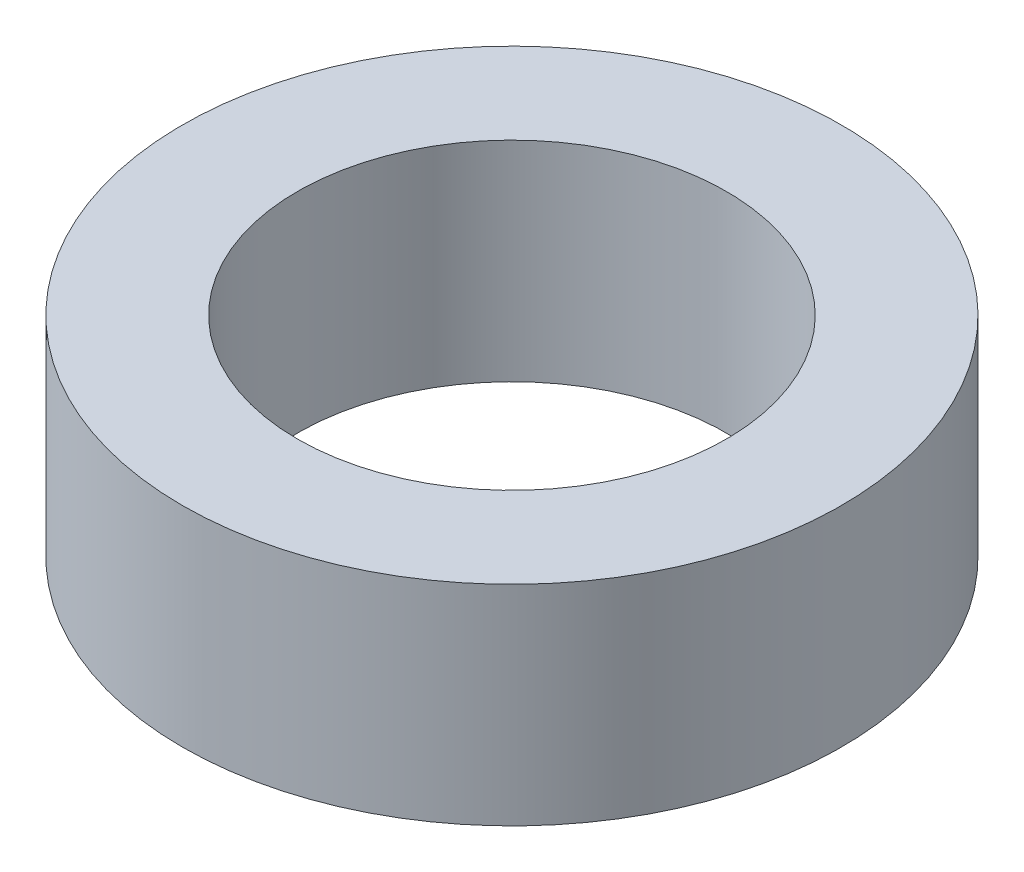
ISO-10303-21;
HEADER;
FILE_DESCRIPTION(('STEP AP214'),'2;1');
FILE_NAME('part.step','',(''),(''),'','','');
FILE_SCHEMA(('AUTOMOTIVE_DESIGN { 1 0 10303 214 1 1 1 1 }'));
ENDSEC;
DATA;
#1=APPLICATION_CONTEXT('core data for automotive mechanical design processes');
#2=APPLICATION_PROTOCOL_DEFINITION('international standard','automotive_design',2000,#1);
#3=PRODUCT_CONTEXT('',#1,'mechanical');
#4=PRODUCT('Part','Part','',(#3));
#5=PRODUCT_RELATED_PRODUCT_CATEGORY('part','',(#4));
#6=PRODUCT_DEFINITION_FORMATION('','',#4);
#7=PRODUCT_DEFINITION_CONTEXT('part definition',#1,'design');
#8=PRODUCT_DEFINITION('design','',#6,#7);
#9=PRODUCT_DEFINITION_SHAPE('','',#8);
#10=(LENGTH_UNIT() NAMED_UNIT(*) SI_UNIT(.MILLI.,.METRE.));
#11=(NAMED_UNIT(*) PLANE_ANGLE_UNIT() SI_UNIT($,.RADIAN.));
#12=(NAMED_UNIT(*) SI_UNIT($,.STERADIAN.) SOLID_ANGLE_UNIT());
#13=UNCERTAINTY_MEASURE_WITH_UNIT(LENGTH_MEASURE(1.E-05),#10,'distance_accuracy_value','');
#14=(GEOMETRIC_REPRESENTATION_CONTEXT(3) GLOBAL_UNCERTAINTY_ASSIGNED_CONTEXT((#13)) GLOBAL_UNIT_ASSIGNED_CONTEXT((#10,
#11,#12)) REPRESENTATION_CONTEXT('',''));
#15=CARTESIAN_POINT('',(0.,0.,0.));
#16=DIRECTION('',(0.,0.,1.));
#17=DIRECTION('',(1.,0.,0.));
#18=AXIS2_PLACEMENT_3D('',#15,#16,#17);
#19=CARTESIAN_POINT('',(0.,2.,0.));
#20=DIRECTION('',(0.,-1.,0.));
#21=DIRECTION('',(0.,0.,-1.));
#22=AXIS2_PLACEMENT_3D('',#19,#20,#21);
#23=CYLINDRICAL_SURFACE('',#22,2.05);
#24=CARTESIAN_POINT('',(0.,2.,0.));
#25=DIRECTION('',(0.,1.,0.));
#26=DIRECTION('',(0.,0.,1.));
#27=AXIS2_PLACEMENT_3D('',#24,#25,#26);
#28=CIRCLE('',#27,2.05);
#29=CARTESIAN_POINT('',(0.,2.,2.05));
#30=VERTEX_POINT('',#29);
#31=EDGE_CURVE('E40',#30,#30,#28,.T.);
#32=ORIENTED_EDGE('',*,*,#31,.T.);
#33=EDGE_LOOP('',(#32));
#34=FACE_BOUND('',#33,.T.);
#35=CARTESIAN_POINT('',(0.,0.,0.));
#36=DIRECTION('',(0.,1.,0.));
#37=DIRECTION('',(0.,0.,1.));
#38=AXIS2_PLACEMENT_3D('',#35,#36,#37);
#39=CIRCLE('',#38,2.05);
#40=CARTESIAN_POINT('',(0.,0.,2.05));
#41=VERTEX_POINT('',#40);
#42=EDGE_CURVE('E46',#41,#41,#39,.T.);
#43=ORIENTED_EDGE('',*,*,#42,.F.);
#44=EDGE_LOOP('',(#43));
#45=FACE_BOUND('',#44,.T.);
#46=ADVANCED_FACE('F33',(#34,#45),#23,.F.);
#47=CARTESIAN_POINT('',(0.,2.,0.));
#48=DIRECTION('',(0.,-1.,0.));
#49=DIRECTION('',(0.,0.,-1.));
#50=AXIS2_PLACEMENT_3D('',#47,#48,#49);
#51=CYLINDRICAL_SURFACE('',#50,3.15);
#52=CARTESIAN_POINT('',(0.,2.,0.));
#53=DIRECTION('',(0.,1.,0.));
#54=DIRECTION('',(0.,0.,1.));
#55=AXIS2_PLACEMENT_3D('',#52,#53,#54);
#56=CIRCLE('',#55,3.15);
#57=CARTESIAN_POINT('',(0.,2.,3.15));
#58=VERTEX_POINT('',#57);
#59=EDGE_CURVE('E10',#58,#58,#56,.T.);
#60=ORIENTED_EDGE('',*,*,#59,.F.);
#61=EDGE_LOOP('',(#60));
#62=FACE_BOUND('',#61,.T.);
#63=CARTESIAN_POINT('',(0.,0.,0.));
#64=DIRECTION('',(0.,1.,0.));
#65=DIRECTION('',(0.,0.,1.));
#66=AXIS2_PLACEMENT_3D('',#63,#64,#65);
#67=CIRCLE('',#66,3.15);
#68=CARTESIAN_POINT('',(0.,0.,3.15));
#69=VERTEX_POINT('',#68);
#70=EDGE_CURVE('E36',#69,#69,#67,.T.);
#71=ORIENTED_EDGE('',*,*,#70,.T.);
#72=EDGE_LOOP('',(#71));
#73=FACE_BOUND('',#72,.T.);
#74=ADVANCED_FACE('F53',(#62,#73),#51,.T.);
#75=CARTESIAN_POINT('',(0.,2.,0.));
#76=DIRECTION('',(0.,1.,0.));
#77=DIRECTION('',(0.,0.,1.));
#78=AXIS2_PLACEMENT_3D('',#75,#76,#77);
#79=PLANE('',#78);
#80=ORIENTED_EDGE('',*,*,#31,.F.);
#81=EDGE_LOOP('',(#80));
#82=FACE_BOUND('',#81,.T.);
#83=ORIENTED_EDGE('',*,*,#59,.T.);
#84=EDGE_LOOP('',(#83));
#85=FACE_BOUND('',#84,.T.);
#86=ADVANCED_FACE('F57',(#82,#85),#79,.T.);
#87=CARTESIAN_POINT('',(0.,0.,0.));
#88=DIRECTION('',(0.,1.,0.));
#89=DIRECTION('',(0.,0.,1.));
#90=AXIS2_PLACEMENT_3D('',#87,#88,#89);
#91=PLANE('',#90);
#92=ORIENTED_EDGE('',*,*,#42,.T.);
#93=EDGE_LOOP('',(#92));
#94=FACE_BOUND('',#93,.T.);
#95=ORIENTED_EDGE('',*,*,#70,.F.);
#96=EDGE_LOOP('',(#95));
#97=FACE_BOUND('',#96,.T.);
#98=ADVANCED_FACE('F55',(#94,#97),#91,.F.);
#99=CLOSED_SHELL('',(#46,#74,#86,#98));
#100=MANIFOLD_SOLID_BREP('B2',#99);
#101=ADVANCED_BREP_SHAPE_REPRESENTATION('',(#18,#100),#14);
#102=SHAPE_DEFINITION_REPRESENTATION(#9,#101);
ENDSEC;
END-ISO-10303-21;
